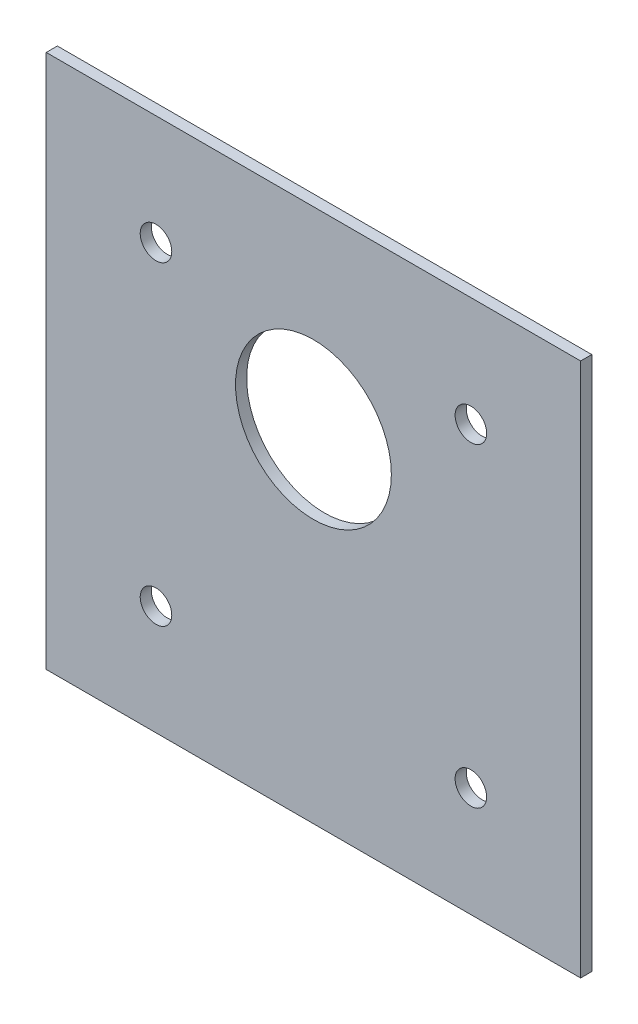
ISO-10303-21;
HEADER;
FILE_DESCRIPTION(('STEP AP214'),'2;1');
FILE_NAME('part.step','',(''),(''),'','','');
FILE_SCHEMA(('AUTOMOTIVE_DESIGN { 1 0 10303 214 1 1 1 1 }'));
ENDSEC;
DATA;
#1=APPLICATION_CONTEXT('core data for automotive mechanical design processes');
#2=APPLICATION_PROTOCOL_DEFINITION('international standard','automotive_design',2000,#1);
#3=PRODUCT_CONTEXT('',#1,'mechanical');
#4=PRODUCT('Part','Part','',(#3));
#5=PRODUCT_RELATED_PRODUCT_CATEGORY('part','',(#4));
#6=PRODUCT_DEFINITION_FORMATION('','',#4);
#7=PRODUCT_DEFINITION_CONTEXT('part definition',#1,'design');
#8=PRODUCT_DEFINITION('design','',#6,#7);
#9=PRODUCT_DEFINITION_SHAPE('','',#8);
#10=(LENGTH_UNIT() NAMED_UNIT(*) SI_UNIT(.MILLI.,.METRE.));
#11=(NAMED_UNIT(*) PLANE_ANGLE_UNIT() SI_UNIT($,.RADIAN.));
#12=(NAMED_UNIT(*) SI_UNIT($,.STERADIAN.) SOLID_ANGLE_UNIT());
#13=UNCERTAINTY_MEASURE_WITH_UNIT(LENGTH_MEASURE(1.E-05),#10,'distance_accuracy_value','');
#14=(GEOMETRIC_REPRESENTATION_CONTEXT(3) GLOBAL_UNCERTAINTY_ASSIGNED_CONTEXT((#13)) GLOBAL_UNIT_ASSIGNED_CONTEXT((#10,
#11,#12)) REPRESENTATION_CONTEXT('',''));
#15=CARTESIAN_POINT('',(0.,0.,0.));
#16=DIRECTION('',(0.,0.,1.));
#17=DIRECTION('',(1.,0.,0.));
#18=AXIS2_PLACEMENT_3D('',#15,#16,#17);
#19=CARTESIAN_POINT('',(0.,0.,3.));
#20=DIRECTION('',(0.,0.,1.));
#21=DIRECTION('',(1.,0.,0.));
#22=AXIS2_PLACEMENT_3D('',#19,#20,#21);
#23=PLANE('',#22);
#24=CARTESIAN_POINT('',(42.4264068711929,-42.4264068711928,3.));
#25=DIRECTION('',(0.,0.,1.));
#26=DIRECTION('',(1.,0.,0.));
#27=AXIS2_PLACEMENT_3D('',#24,#25,#26);
#28=CIRCLE('',#27,4.25000000000001);
#29=CARTESIAN_POINT('',(46.6764068711929,-42.4264068711928,3.));
#30=VERTEX_POINT('',#29);
#31=EDGE_CURVE('E117',#30,#30,#28,.T.);
#32=ORIENTED_EDGE('',*,*,#31,.F.);
#33=EDGE_LOOP('',(#32));
#34=FACE_BOUND('',#33,.T.);
#35=CARTESIAN_POINT('',(-42.4264068711929,42.4264068711928,3.));
#36=DIRECTION('',(0.,0.,1.));
#37=DIRECTION('',(1.,0.,0.));
#38=AXIS2_PLACEMENT_3D('',#35,#36,#37);
#39=CIRCLE('',#38,4.25000000000001);
#40=CARTESIAN_POINT('',(-38.1764068711929,42.4264068711928,3.));
#41=VERTEX_POINT('',#40);
#42=EDGE_CURVE('E129',#41,#41,#39,.T.);
#43=ORIENTED_EDGE('',*,*,#42,.F.);
#44=EDGE_LOOP('',(#43));
#45=FACE_BOUND('',#44,.T.);
#46=CARTESIAN_POINT('',(0.,20.,3.));
#47=DIRECTION('',(0.,0.,1.));
#48=DIRECTION('',(1.,0.,0.));
#49=AXIS2_PLACEMENT_3D('',#46,#47,#48);
#50=CIRCLE('',#49,21.);
#51=CARTESIAN_POINT('',(21.,20.,3.));
#52=VERTEX_POINT('',#51);
#53=EDGE_CURVE('E11',#52,#52,#50,.T.);
#54=ORIENTED_EDGE('',*,*,#53,.F.);
#55=EDGE_LOOP('',(#54));
#56=FACE_BOUND('',#55,.T.);
#57=CARTESIAN_POINT('',(42.4264068711929,42.4264068711929,3.));
#58=DIRECTION('',(0.,0.,1.));
#59=DIRECTION('',(1.,0.,0.));
#60=AXIS2_PLACEMENT_3D('',#57,#58,#59);
#61=CIRCLE('',#60,4.25000000000001);
#62=CARTESIAN_POINT('',(46.6764068711929,42.4264068711929,3.));
#63=VERTEX_POINT('',#62);
#64=EDGE_CURVE('E123',#63,#63,#61,.T.);
#65=ORIENTED_EDGE('',*,*,#64,.F.);
#66=EDGE_LOOP('',(#65));
#67=FACE_BOUND('',#66,.T.);
#68=CARTESIAN_POINT('',(-42.4264068711928,-42.4264068711929,3.));
#69=DIRECTION('',(0.,0.,1.));
#70=DIRECTION('',(1.,0.,0.));
#71=AXIS2_PLACEMENT_3D('',#68,#69,#70);
#72=CIRCLE('',#71,4.25000000000001);
#73=CARTESIAN_POINT('',(-38.1764068711928,-42.4264068711929,3.));
#74=VERTEX_POINT('',#73);
#75=EDGE_CURVE('E111',#74,#74,#72,.T.);
#76=ORIENTED_EDGE('',*,*,#75,.F.);
#77=EDGE_LOOP('',(#76));
#78=FACE_BOUND('',#77,.T.);
#79=DIRECTION('',(1.,0.,0.));
#80=VECTOR('',#79,1.);
#81=CARTESIAN_POINT('',(72.,72.,3.));
#82=LINE('',#81,#80);
#83=CARTESIAN_POINT('',(-72.,72.,3.));
#84=VERTEX_POINT('',#83);
#85=CARTESIAN_POINT('',(72.,72.,3.));
#86=VERTEX_POINT('',#85);
#87=EDGE_CURVE('E93',#84,#86,#82,.T.);
#88=ORIENTED_EDGE('',*,*,#87,.F.);
#89=DIRECTION('',(0.,1.,0.));
#90=VECTOR('',#89,1.);
#91=CARTESIAN_POINT('',(-72.,72.,3.));
#92=LINE('',#91,#90);
#93=CARTESIAN_POINT('',(-72.,-72.,3.));
#94=VERTEX_POINT('',#93);
#95=EDGE_CURVE('E90',#94,#84,#92,.T.);
#96=ORIENTED_EDGE('',*,*,#95,.F.);
#97=DIRECTION('',(-1.,0.,0.));
#98=VECTOR('',#97,1.);
#99=CARTESIAN_POINT('',(72.,-72.,3.));
#100=LINE('',#99,#98);
#101=CARTESIAN_POINT('',(72.,-72.,3.));
#102=VERTEX_POINT('',#101);
#103=EDGE_CURVE('E83',#102,#94,#100,.T.);
#104=ORIENTED_EDGE('',*,*,#103,.F.);
#105=DIRECTION('',(0.,-1.,0.));
#106=VECTOR('',#105,1.);
#107=CARTESIAN_POINT('',(72.,72.,3.));
#108=LINE('',#107,#106);
#109=EDGE_CURVE('E89',#86,#102,#108,.T.);
#110=ORIENTED_EDGE('',*,*,#109,.F.);
#111=EDGE_LOOP('',(#88,#96,#104,#110));
#112=FACE_BOUND('',#111,.T.);
#113=ADVANCED_FACE('F32',(#34,#45,#56,#67,#78,#112),#23,.T.);
#114=CARTESIAN_POINT('',(0.,0.,0.));
#115=DIRECTION('',(0.,0.,1.));
#116=DIRECTION('',(1.,0.,0.));
#117=AXIS2_PLACEMENT_3D('',#114,#115,#116);
#118=PLANE('',#117);
#119=CARTESIAN_POINT('',(0.,20.,0.));
#120=DIRECTION('',(0.,0.,1.));
#121=DIRECTION('',(1.,0.,0.));
#122=AXIS2_PLACEMENT_3D('',#119,#120,#121);
#123=CIRCLE('',#122,21.);
#124=CARTESIAN_POINT('',(21.,20.,0.));
#125=VERTEX_POINT('',#124);
#126=EDGE_CURVE('E36',#125,#125,#123,.T.);
#127=ORIENTED_EDGE('',*,*,#126,.T.);
#128=EDGE_LOOP('',(#127));
#129=FACE_BOUND('',#128,.T.);
#130=CARTESIAN_POINT('',(-42.4264068711929,42.4264068711928,0.));
#131=DIRECTION('',(0.,0.,1.));
#132=DIRECTION('',(1.,0.,0.));
#133=AXIS2_PLACEMENT_3D('',#130,#131,#132);
#134=CIRCLE('',#133,4.25000000000001);
#135=CARTESIAN_POINT('',(-38.1764068711929,42.4264068711928,0.));
#136=VERTEX_POINT('',#135);
#137=EDGE_CURVE('E126',#136,#136,#134,.T.);
#138=ORIENTED_EDGE('',*,*,#137,.T.);
#139=EDGE_LOOP('',(#138));
#140=FACE_BOUND('',#139,.T.);
#141=CARTESIAN_POINT('',(42.4264068711929,42.4264068711929,0.));
#142=DIRECTION('',(0.,0.,1.));
#143=DIRECTION('',(1.,0.,0.));
#144=AXIS2_PLACEMENT_3D('',#141,#142,#143);
#145=CIRCLE('',#144,4.25000000000001);
#146=CARTESIAN_POINT('',(46.6764068711929,42.4264068711929,0.));
#147=VERTEX_POINT('',#146);
#148=EDGE_CURVE('E120',#147,#147,#145,.T.);
#149=ORIENTED_EDGE('',*,*,#148,.T.);
#150=EDGE_LOOP('',(#149));
#151=FACE_BOUND('',#150,.T.);
#152=CARTESIAN_POINT('',(42.4264068711929,-42.4264068711928,0.));
#153=DIRECTION('',(0.,0.,1.));
#154=DIRECTION('',(1.,0.,0.));
#155=AXIS2_PLACEMENT_3D('',#152,#153,#154);
#156=CIRCLE('',#155,4.25000000000001);
#157=CARTESIAN_POINT('',(46.6764068711929,-42.4264068711928,0.));
#158=VERTEX_POINT('',#157);
#159=EDGE_CURVE('E114',#158,#158,#156,.T.);
#160=ORIENTED_EDGE('',*,*,#159,.T.);
#161=EDGE_LOOP('',(#160));
#162=FACE_BOUND('',#161,.T.);
#163=CARTESIAN_POINT('',(-42.4264068711928,-42.4264068711929,0.));
#164=DIRECTION('',(0.,0.,1.));
#165=DIRECTION('',(1.,0.,0.));
#166=AXIS2_PLACEMENT_3D('',#163,#164,#165);
#167=CIRCLE('',#166,4.25000000000001);
#168=CARTESIAN_POINT('',(-38.1764068711928,-42.4264068711929,0.));
#169=VERTEX_POINT('',#168);
#170=EDGE_CURVE('E108',#169,#169,#167,.T.);
#171=ORIENTED_EDGE('',*,*,#170,.T.);
#172=EDGE_LOOP('',(#171));
#173=FACE_BOUND('',#172,.T.);
#174=DIRECTION('',(1.,0.,0.));
#175=VECTOR('',#174,1.);
#176=CARTESIAN_POINT('',(72.,72.,0.));
#177=LINE('',#176,#175);
#178=CARTESIAN_POINT('',(-72.,72.,0.));
#179=VERTEX_POINT('',#178);
#180=CARTESIAN_POINT('',(72.,72.,0.));
#181=VERTEX_POINT('',#180);
#182=EDGE_CURVE('E99',#179,#181,#177,.T.);
#183=ORIENTED_EDGE('',*,*,#182,.T.);
#184=DIRECTION('',(0.,-1.,0.));
#185=VECTOR('',#184,1.);
#186=CARTESIAN_POINT('',(72.,72.,0.));
#187=LINE('',#186,#185);
#188=CARTESIAN_POINT('',(72.,-72.,0.));
#189=VERTEX_POINT('',#188);
#190=EDGE_CURVE('E102',#181,#189,#187,.T.);
#191=ORIENTED_EDGE('',*,*,#190,.T.);
#192=DIRECTION('',(-1.,0.,0.));
#193=VECTOR('',#192,1.);
#194=CARTESIAN_POINT('',(72.,-72.,0.));
#195=LINE('',#194,#193);
#196=CARTESIAN_POINT('',(-72.,-72.,0.));
#197=VERTEX_POINT('',#196);
#198=EDGE_CURVE('E85',#189,#197,#195,.T.);
#199=ORIENTED_EDGE('',*,*,#198,.T.);
#200=DIRECTION('',(0.,1.,0.));
#201=VECTOR('',#200,1.);
#202=CARTESIAN_POINT('',(-72.,72.,0.));
#203=LINE('',#202,#201);
#204=EDGE_CURVE('E95',#197,#179,#203,.T.);
#205=ORIENTED_EDGE('',*,*,#204,.T.);
#206=EDGE_LOOP('',(#183,#191,#199,#205));
#207=FACE_BOUND('',#206,.T.);
#208=ADVANCED_FACE('F34',(#129,#140,#151,#162,#173,#207),#118,.F.);
#209=CARTESIAN_POINT('',(0.,20.,3.));
#210=DIRECTION('',(0.,0.,-1.));
#211=DIRECTION('',(-1.,0.,0.));
#212=AXIS2_PLACEMENT_3D('',#209,#210,#211);
#213=CYLINDRICAL_SURFACE('',#212,21.);
#214=ORIENTED_EDGE('',*,*,#53,.T.);
#215=EDGE_LOOP('',(#214));
#216=FACE_BOUND('',#215,.T.);
#217=ORIENTED_EDGE('',*,*,#126,.F.);
#218=EDGE_LOOP('',(#217));
#219=FACE_BOUND('',#218,.T.);
#220=ADVANCED_FACE('F140',(#216,#219),#213,.F.);
#221=CARTESIAN_POINT('',(-42.4264068711929,42.4264068711928,3.));
#222=DIRECTION('',(0.,0.,-1.));
#223=DIRECTION('',(-1.,0.,0.));
#224=AXIS2_PLACEMENT_3D('',#221,#222,#223);
#225=CYLINDRICAL_SURFACE('',#224,4.25000000000001);
#226=ORIENTED_EDGE('',*,*,#42,.T.);
#227=EDGE_LOOP('',(#226));
#228=FACE_BOUND('',#227,.T.);
#229=ORIENTED_EDGE('',*,*,#137,.F.);
#230=EDGE_LOOP('',(#229));
#231=FACE_BOUND('',#230,.T.);
#232=ADVANCED_FACE('F137',(#228,#231),#225,.F.);
#233=CARTESIAN_POINT('',(42.4264068711929,42.4264068711929,3.));
#234=DIRECTION('',(0.,0.,-1.));
#235=DIRECTION('',(-1.,0.,0.));
#236=AXIS2_PLACEMENT_3D('',#233,#234,#235);
#237=CYLINDRICAL_SURFACE('',#236,4.25000000000001);
#238=ORIENTED_EDGE('',*,*,#64,.T.);
#239=EDGE_LOOP('',(#238));
#240=FACE_BOUND('',#239,.T.);
#241=ORIENTED_EDGE('',*,*,#148,.F.);
#242=EDGE_LOOP('',(#241));
#243=FACE_BOUND('',#242,.T.);
#244=ADVANCED_FACE('F139',(#240,#243),#237,.F.);
#245=CARTESIAN_POINT('',(42.4264068711929,-42.4264068711928,3.));
#246=DIRECTION('',(0.,0.,-1.));
#247=DIRECTION('',(-1.,0.,0.));
#248=AXIS2_PLACEMENT_3D('',#245,#246,#247);
#249=CYLINDRICAL_SURFACE('',#248,4.25000000000001);
#250=ORIENTED_EDGE('',*,*,#31,.T.);
#251=EDGE_LOOP('',(#250));
#252=FACE_BOUND('',#251,.T.);
#253=ORIENTED_EDGE('',*,*,#159,.F.);
#254=EDGE_LOOP('',(#253));
#255=FACE_BOUND('',#254,.T.);
#256=ADVANCED_FACE('F147',(#252,#255),#249,.F.);
#257=CARTESIAN_POINT('',(-42.4264068711928,-42.4264068711929,3.));
#258=DIRECTION('',(0.,0.,-1.));
#259=DIRECTION('',(-1.,0.,0.));
#260=AXIS2_PLACEMENT_3D('',#257,#258,#259);
#261=CYLINDRICAL_SURFACE('',#260,4.25000000000001);
#262=ORIENTED_EDGE('',*,*,#75,.T.);
#263=EDGE_LOOP('',(#262));
#264=FACE_BOUND('',#263,.T.);
#265=ORIENTED_EDGE('',*,*,#170,.F.);
#266=EDGE_LOOP('',(#265));
#267=FACE_BOUND('',#266,.T.);
#268=ADVANCED_FACE('F168',(#264,#267),#261,.F.);
#269=CARTESIAN_POINT('',(72.,72.,3.));
#270=DIRECTION('',(0.,1.,0.));
#271=DIRECTION('',(0.,0.,1.));
#272=AXIS2_PLACEMENT_3D('',#269,#270,#271);
#273=PLANE('',#272);
#274=ORIENTED_EDGE('',*,*,#182,.F.);
#275=DIRECTION('',(0.,0.,-1.));
#276=VECTOR('',#275,1.);
#277=CARTESIAN_POINT('',(-72.,72.,3.));
#278=LINE('',#277,#276);
#279=EDGE_CURVE('E49',#84,#179,#278,.T.);
#280=ORIENTED_EDGE('',*,*,#279,.F.);
#281=ORIENTED_EDGE('',*,*,#87,.T.);
#282=DIRECTION('',(0.,0.,-1.));
#283=VECTOR('',#282,1.);
#284=CARTESIAN_POINT('',(72.,72.,3.));
#285=LINE('',#284,#283);
#286=EDGE_CURVE('E77',#86,#181,#285,.T.);
#287=ORIENTED_EDGE('',*,*,#286,.T.);
#288=EDGE_LOOP('',(#274,#280,#281,#287));
#289=FACE_BOUND('',#288,.T.);
#290=ADVANCED_FACE('F171',(#289),#273,.T.);
#291=CARTESIAN_POINT('',(-72.,72.,3.));
#292=DIRECTION('',(-1.,0.,0.));
#293=DIRECTION('',(0.,0.,1.));
#294=AXIS2_PLACEMENT_3D('',#291,#292,#293);
#295=PLANE('',#294);
#296=ORIENTED_EDGE('',*,*,#204,.F.);
#297=DIRECTION('',(0.,0.,-1.));
#298=VECTOR('',#297,1.);
#299=CARTESIAN_POINT('',(-72.,-72.,3.));
#300=LINE('',#299,#298);
#301=EDGE_CURVE('E66',#94,#197,#300,.T.);
#302=ORIENTED_EDGE('',*,*,#301,.F.);
#303=ORIENTED_EDGE('',*,*,#95,.T.);
#304=ORIENTED_EDGE('',*,*,#279,.T.);
#305=EDGE_LOOP('',(#296,#302,#303,#304));
#306=FACE_BOUND('',#305,.T.);
#307=ADVANCED_FACE('F176',(#306),#295,.T.);
#308=CARTESIAN_POINT('',(72.,-72.,3.));
#309=DIRECTION('',(0.,-1.,0.));
#310=DIRECTION('',(1.,0.,0.));
#311=AXIS2_PLACEMENT_3D('',#308,#309,#310);
#312=PLANE('',#311);
#313=ORIENTED_EDGE('',*,*,#198,.F.);
#314=DIRECTION('',(0.,0.,-1.));
#315=VECTOR('',#314,1.);
#316=CARTESIAN_POINT('',(72.,-72.,3.));
#317=LINE('',#316,#315);
#318=EDGE_CURVE('E80',#102,#189,#317,.T.);
#319=ORIENTED_EDGE('',*,*,#318,.F.);
#320=ORIENTED_EDGE('',*,*,#103,.T.);
#321=ORIENTED_EDGE('',*,*,#301,.T.);
#322=EDGE_LOOP('',(#313,#319,#320,#321));
#323=FACE_BOUND('',#322,.T.);
#324=ADVANCED_FACE('F82',(#323),#312,.T.);
#325=CARTESIAN_POINT('',(72.,72.,3.));
#326=DIRECTION('',(1.,0.,0.));
#327=DIRECTION('',(0.,0.,-1.));
#328=AXIS2_PLACEMENT_3D('',#325,#326,#327);
#329=PLANE('',#328);
#330=ORIENTED_EDGE('',*,*,#190,.F.);
#331=ORIENTED_EDGE('',*,*,#286,.F.);
#332=ORIENTED_EDGE('',*,*,#109,.T.);
#333=ORIENTED_EDGE('',*,*,#318,.T.);
#334=EDGE_LOOP('',(#330,#331,#332,#333));
#335=FACE_BOUND('',#334,.T.);
#336=ADVANCED_FACE('F92',(#335),#329,.T.);
#337=CLOSED_SHELL('',(#113,#208,#220,#232,#244,#256,#268,#290,#307,#324,#336));
#338=MANIFOLD_SOLID_BREP('B2',#337);
#339=ADVANCED_BREP_SHAPE_REPRESENTATION('',(#18,#338),#14);
#340=SHAPE_DEFINITION_REPRESENTATION(#9,#339);
ENDSEC;
END-ISO-10303-21;
